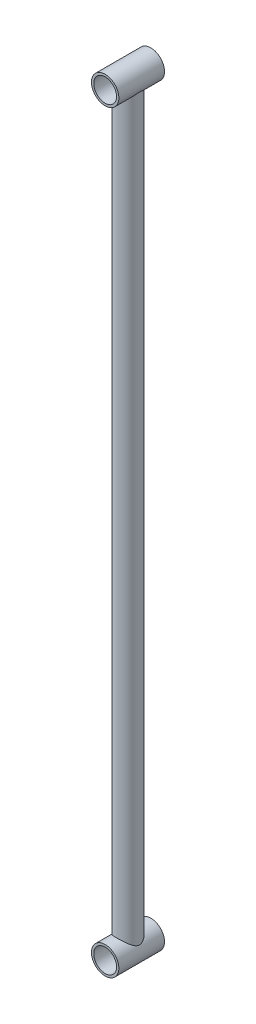
ISO-10303-21;
HEADER;
FILE_DESCRIPTION(('STEP AP214'),'2;1');
FILE_NAME('part.step','',(''),(''),'','','');
FILE_SCHEMA(('AUTOMOTIVE_DESIGN { 1 0 10303 214 1 1 1 1 }'));
ENDSEC;
DATA;
#1=APPLICATION_CONTEXT('core data for automotive mechanical design processes');
#2=APPLICATION_PROTOCOL_DEFINITION('international standard','automotive_design',2000,#1);
#3=PRODUCT_CONTEXT('',#1,'mechanical');
#4=PRODUCT('Part','Part','',(#3));
#5=PRODUCT_RELATED_PRODUCT_CATEGORY('part','',(#4));
#6=PRODUCT_DEFINITION_FORMATION('','',#4);
#7=PRODUCT_DEFINITION_CONTEXT('part definition',#1,'design');
#8=PRODUCT_DEFINITION('design','',#6,#7);
#9=PRODUCT_DEFINITION_SHAPE('','',#8);
#10=(LENGTH_UNIT() NAMED_UNIT(*) SI_UNIT(.MILLI.,.METRE.));
#11=(NAMED_UNIT(*) PLANE_ANGLE_UNIT() SI_UNIT($,.RADIAN.));
#12=(NAMED_UNIT(*) SI_UNIT($,.STERADIAN.) SOLID_ANGLE_UNIT());
#13=UNCERTAINTY_MEASURE_WITH_UNIT(LENGTH_MEASURE(1.E-05),#10,'distance_accuracy_value','');
#14=(GEOMETRIC_REPRESENTATION_CONTEXT(3) GLOBAL_UNCERTAINTY_ASSIGNED_CONTEXT((#13)) GLOBAL_UNIT_ASSIGNED_CONTEXT((#10,
#11,#12)) REPRESENTATION_CONTEXT('',''));
#15=CARTESIAN_POINT('',(0.,0.,0.));
#16=DIRECTION('',(0.,0.,1.));
#17=DIRECTION('',(1.,0.,0.));
#18=AXIS2_PLACEMENT_3D('',#15,#16,#17);
#19=CARTESIAN_POINT('',(0.,104.775,0.));
#20=DIRECTION('',(0.,-1.,0.));
#21=DIRECTION('',(0.,0.,-1.));
#22=AXIS2_PLACEMENT_3D('',#19,#20,#21);
#23=CYLINDRICAL_SURFACE('',#22,3.175);
#24=CARTESIAN_POINT('',(0.,-100.965,-3.175));
#25=CARTESIAN_POINT('',(-0.150822211930841,-100.965006073135,-3.17499378688627));
#26=CARTESIAN_POINT('',(-0.301690443543293,-100.97403411179,-3.16417620713812));
#27=CARTESIAN_POINT('',(-0.598401448690301,-101.00931308306,-3.12170755440397));
#28=CARTESIAN_POINT('',(-0.744240416126178,-101.0355767709,-3.09004105213718));
#29=CARTESIAN_POINT('',(-1.02594514279661,-101.102888730367,-3.00823277189605));
#30=CARTESIAN_POINT('',(-1.16186480706273,-101.143848602994,-2.95820141968177));
#31=CARTESIAN_POINT('',(-1.42219442693835,-101.237676112164,-2.84224148606259));
#32=CARTESIAN_POINT('',(-1.54660047408831,-101.290547771567,-2.77630753348651));
#33=CARTESIAN_POINT('',(-1.82615409494026,-101.426354867903,-2.60417772613267));
#34=CARTESIAN_POINT('',(-1.97580861746992,-101.513199724603,-2.49208889633074));
#35=CARTESIAN_POINT('',(-2.18170392969783,-101.650397122028,-2.30852867378388));
#36=CARTESIAN_POINT('',(-2.24734328885135,-101.697379079135,-2.24463663411199));
#37=CARTESIAN_POINT('',(-2.37241559323832,-101.7927341327,-2.11200517803447));
#38=CARTESIAN_POINT('',(-2.43185081191422,-101.841106711234,-2.0432675528215));
#39=CARTESIAN_POINT('',(-2.54554306145352,-101.939148731739,-1.89983443364988));
#40=CARTESIAN_POINT('',(-2.59968379340744,-101.988825599408,-1.82505217022288));
#41=CARTESIAN_POINT('',(-2.70148698448596,-102.087419895249,-1.67067213031026));
#42=CARTESIAN_POINT('',(-2.74914727429901,-102.136337064283,-1.59107275413046));
#43=CARTESIAN_POINT('',(-2.83770152724148,-102.231817655537,-1.42714203479656));
#44=CARTESIAN_POINT('',(-2.87861142892789,-102.278386436525,-1.34282248643763));
#45=CARTESIAN_POINT('',(-2.95343206651851,-102.367363499049,-1.16910280679462));
#46=CARTESIAN_POINT('',(-2.98734876608987,-102.409775309237,-1.07970708805111));
#47=CARTESIAN_POINT('',(-3.05045756735011,-102.491642592922,-0.886882922117579));
#48=CARTESIAN_POINT('',(-3.0789093422056,-102.530448838894,-0.782924439120834));
#49=CARTESIAN_POINT('',(-3.12548669863083,-102.595766618533,-0.569099957739516));
#50=CARTESIAN_POINT('',(-3.14363734371447,-102.622307964219,-0.45924901591517));
#51=CARTESIAN_POINT('',(-3.1684096231137,-102.65891419836,-0.233977950708097));
#52=CARTESIAN_POINT('',(-3.17488831380236,-102.668774712711,-0.118506333038371));
#53=CARTESIAN_POINT('',(-3.1751088214567,-102.669107484783,0.112474559572194));
#54=CARTESIAN_POINT('',(-3.16885047147159,-102.65957948837,0.227983834986789));
#55=CARTESIAN_POINT('',(-3.14331687074316,-102.621821169251,0.464216225799318));
#56=CARTESIAN_POINT('',(-3.12300099714952,-102.592099426649,0.584572451296942));
#57=CARTESIAN_POINT('',(-3.07013022301828,-102.518359442343,0.818148553911832));
#58=CARTESIAN_POINT('',(-3.03753470891272,-102.474293826329,0.931343278003963));
#59=CARTESIAN_POINT('',(-2.96946713526924,-102.387371620458,1.12753857958931));
#60=CARTESIAN_POINT('',(-2.93595611073522,-102.346120612189,1.21197043377846));
#61=CARTESIAN_POINT('',(-2.86263450076783,-102.260121006486,1.37624264229306));
#62=CARTESIAN_POINT('',(-2.82282022117913,-102.21537036585,1.45608026642605));
#63=CARTESIAN_POINT('',(-2.737123541728,-102.123926671074,1.61141469924887));
#64=CARTESIAN_POINT('',(-2.69123299958051,-102.077231069241,1.68690548483916));
#65=CARTESIAN_POINT('',(-2.59356538330475,-101.983205555332,1.83352148541103));
#66=CARTESIAN_POINT('',(-2.54178949143858,-101.93587577233,1.90464757277783));
#67=CARTESIAN_POINT('',(-2.42951698129755,-101.839132829216,2.04612861759571));
#68=CARTESIAN_POINT('',(-2.36870621957647,-101.789739885102,2.11624950855538));
#69=CARTESIAN_POINT('',(-2.24061704208414,-101.692431913034,2.251431693159));
#70=CARTESIAN_POINT('',(-2.17333605668939,-101.644517482328,2.3164909578878));
#71=CARTESIAN_POINT('',(-1.96202962966033,-101.504691065171,2.50325715541089));
#72=CARTESIAN_POINT('',(-1.8081760202615,-101.416368515353,2.61701675075466));
#73=CARTESIAN_POINT('',(-1.51651718744448,-101.277043768211,2.79326540719812));
#74=CARTESIAN_POINT('',(-1.38398135723523,-101.22219627429,2.86148984440411));
#75=CARTESIAN_POINT('',(-1.10623310991177,-101.126190568919,2.97985692174476));
#76=CARTESIAN_POINT('',(-0.961028675731065,-101.085023814294,3.03001084797634));
#77=CARTESIAN_POINT('',(-0.735782533163238,-101.035917182569,3.08956068904863));
#78=CARTESIAN_POINT('',(-0.659105251542801,-101.021620844953,3.1068381749323));
#79=CARTESIAN_POINT('',(-0.5039929094941,-100.997668519091,3.1357336252596));
#80=CARTESIAN_POINT('',(-0.425558729080255,-100.988010259768,3.14735435962114));
#81=CARTESIAN_POINT('',(-0.267613766694443,-100.973583326387,3.16469854719628));
#82=CARTESIAN_POINT('',(-0.188103294378078,-100.968813275034,3.17042366155495));
#83=CARTESIAN_POINT('',(-0.0287609172063097,-100.964273313947,3.17587210143098));
#84=CARTESIAN_POINT('',(0.0510709517295108,-100.964502860158,3.17559607999075));
#85=CARTESIAN_POINT('',(0.270806444569592,-100.972062740094,3.16652460681941));
#86=CARTESIAN_POINT('',(0.410349895405356,-100.984646465584,3.15142655934367));
#87=CARTESIAN_POINT('',(0.684104999351103,-101.024360993693,3.10354494319568));
#88=CARTESIAN_POINT('',(0.818316010811665,-101.051493541303,3.07075925305744));
#89=CARTESIAN_POINT('',(1.08021205051514,-101.118804951484,2.98878648153561));
#90=CARTESIAN_POINT('',(1.20778546163934,-101.159153847951,2.93938540115662));
#91=CARTESIAN_POINT('',(1.45244504548873,-101.250287792534,2.82652074436458));
#92=CARTESIAN_POINT('',(1.56952731907496,-101.301076697875,2.76305196974067));
#93=CARTESIAN_POINT('',(1.84237637325781,-101.435232697248,2.59277570023338));
#94=CARTESIAN_POINT('',(1.99188980965388,-101.522984618519,2.4793083516323));
#95=CARTESIAN_POINT('',(2.19739618958484,-101.66140876003,2.29361331504068));
#96=CARTESIAN_POINT('',(2.26288530573975,-101.708786476106,2.22898487800641));
#97=CARTESIAN_POINT('',(2.3875915478425,-101.804868185053,2.09485196479308));
#98=CARTESIAN_POINT('',(2.44681106677348,-101.85357166292,2.02534936594778));
#99=CARTESIAN_POINT('',(2.55997146983506,-101.95216767485,1.88036843728749));
#100=CARTESIAN_POINT('',(2.61379799811067,-102.002065820305,1.80480499133832));
#101=CARTESIAN_POINT('',(2.7149027848302,-102.100976499726,1.64880876354097));
#102=CARTESIAN_POINT('',(2.76217868695505,-102.149988709528,1.56837424439768));
#103=CARTESIAN_POINT('',(2.84986479530632,-102.245463007663,1.402731275326));
#104=CARTESIAN_POINT('',(2.89029310458778,-102.291931593013,1.31753623073996));
#105=CARTESIAN_POINT('',(2.96403866535854,-102.380446080838,1.14199615177066));
#106=CARTESIAN_POINT('',(2.99736243306947,-102.422496017945,1.05165593372184));
#107=CARTESIAN_POINT('',(3.05863438069324,-102.502645387512,0.85817675717233));
#108=CARTESIAN_POINT('',(3.08595157784812,-102.540171951302,0.754590283142033));
#109=CARTESIAN_POINT('',(3.13032466121903,-102.602753097614,0.541715982577732));
#110=CARTESIAN_POINT('',(3.14740617392447,-102.627838800195,0.43244314528516));
#111=CARTESIAN_POINT('',(3.17013957612192,-102.661525484273,0.208740257934578));
#112=CARTESIAN_POINT('',(3.17565785999514,-102.669933709663,0.0942653723089426));
#113=CARTESIAN_POINT('',(3.17421509286501,-102.667761282413,-0.134433621338763));
#114=CARTESIAN_POINT('',(3.16725075125176,-102.657175622696,-0.248657655284779));
#115=CARTESIAN_POINT('',(3.14026889782403,-102.617360180191,-0.484724010216901));
#116=CARTESIAN_POINT('',(3.11894000449995,-102.586264565751,-0.606081817587711));
#117=CARTESIAN_POINT('',(3.06387912815266,-102.509844176245,-0.841415374096074));
#118=CARTESIAN_POINT('',(3.03010612437192,-102.464472414373,-0.95536522532451));
#119=CARTESIAN_POINT('',(2.95974616986959,-102.375301667574,-1.1528902082544));
#120=CARTESIAN_POINT('',(2.92514020824604,-102.333071504198,-1.23791824005944));
#121=CARTESIAN_POINT('',(2.84950508751847,-102.245221372332,-1.40328824862223));
#122=CARTESIAN_POINT('',(2.80847219392224,-102.199599441137,-1.48362746336257));
#123=CARTESIAN_POINT('',(2.72020405219331,-102.106533762075,-1.6398704117791));
#124=CARTESIAN_POINT('',(2.67296054253818,-102.059087648184,-1.71576803929565));
#125=CARTESIAN_POINT('',(2.57244498764799,-101.963695979689,-1.8630894354351));
#126=CARTESIAN_POINT('',(2.51917415808048,-101.915750527563,-1.93451410172382));
#127=CARTESIAN_POINT('',(2.40385916661768,-101.818051793767,-2.0762540808046));
#128=CARTESIAN_POINT('',(2.34151296317675,-101.768325087423,-2.14634342701283));
#129=CARTESIAN_POINT('',(2.21022611937576,-101.670531701715,-2.28131637653497));
#130=CARTESIAN_POINT('',(2.14128276360214,-101.622465717085,-2.34619781587424));
#131=CARTESIAN_POINT('',(1.92481569991962,-101.482500145393,-2.53214893370211));
#132=CARTESIAN_POINT('',(1.76727022711828,-101.394493094446,-2.64500363295819));
#133=CARTESIAN_POINT('',(1.47135047042502,-101.257822867897,-2.81726894962884));
#134=CARTESIAN_POINT('',(1.33857456032353,-101.204872770339,-2.88295154675527));
#135=CARTESIAN_POINT('',(1.0610124126945,-101.112812065803,-2.99620507595873));
#136=CARTESIAN_POINT('',(0.91624249032127,-101.073683027923,-3.0438001349298));
#137=CARTESIAN_POINT('',(0.643406655873653,-101.017593399518,-3.11173987048758));
#138=CARTESIAN_POINT('',(0.516693515753986,-100.997992662401,-3.13534453629448));
#139=CARTESIAN_POINT('',(0.259998091130878,-100.971694009641,-3.16697647660939));
#140=CARTESIAN_POINT('',(0.130016144835493,-100.96499476466,-3.1750053560088));
#141=CARTESIAN_POINT('',(0.,-100.965,-3.175));
#142=B_SPLINE_CURVE_WITH_KNOTS('',3,(#24,#25,#26,#27,#28,#29,#30,#31,#32,#33,#34,#35,#36,#37,
#38,#39,#40,#41,#42,#43,#44,#45,#46,#47,#48,#49,#50,#51,#52,#53,#54,#55,#56,#57,#58,#59,#60,#61,
#62,#63,#64,#65,#66,#67,#68,#69,#70,#71,#72,#73,#74,#75,#76,#77,#78,#79,#80,#81,#82,#83,#84,#85,
#86,#87,#88,#89,#90,#91,#92,#93,#94,#95,#96,#97,#98,#99,#100,#101,#102,#103,#104,#105,#106,#107,
#108,#109,#110,#111,#112,#113,#114,#115,#116,#117,#118,#119,#120,#121,#122,#123,#124,#125,#126,
#127,#128,#129,#130,#131,#132,#133,#134,#135,#136,#137,#138,#139,#140,#141),.UNSPECIFIED.,.T.,
.F.,(4,2,2,2,2,2,2,2,2,2,2,2,2,2,2,2,2,2,2,2,2,2,2,2,2,2,2,2,2,2,2,2,2,2,2,2,2,2,2,2,2,2,2,2,2,
2,2,2,2,2,2,2,2,2,2,2,2,2,4),(0.,0.451918421555196,0.90417166260424,1.35374894806629,
1.80347829334246,2.41839977025361,2.72701799603031,3.03552273192493,3.34974152574338,
3.66406524590609,3.97763584416515,4.29093791931023,4.63359226787793,4.97540929555955,
5.32138473147249,5.66736470228832,6.04215732186178,6.41820056754933,6.71711983599405,
7.01621494535695,7.31571498144281,7.6151549592699,7.93022593415776,8.24542255908012,
8.87381282386929,9.34860609577829,9.82310231522312,10.0624740368443,10.3017284281116,
10.5409153887976,10.7800763213364,11.2006233771617,11.6212208848594,12.0474573079466,
12.4738514947403,13.0918171368879,13.4020682167871,13.7122004497068,14.0279214775753,
14.3437557799352,14.6587416141479,14.9734372913319,15.3129447407211,15.6515985944804,
15.9941442726696,16.3367802643905,16.7159132139336,17.0963072841967,17.3990678074814,
17.7020049127365,18.0053491494056,18.3086323123993,18.6267807496175,18.9450607059121,
19.5795398645421,20.0497356350819,20.5193019933689,20.9089179875348,21.2984938344776),.UNSPECIFIED.);
#143=CARTESIAN_POINT('',(0.,-100.965,-3.175));
#144=VERTEX_POINT('',#143);
#145=EDGE_CURVE('E39',#144,#144,#142,.T.);
#146=ORIENTED_EDGE('',*,*,#145,.T.);
#147=EDGE_LOOP('',(#146));
#148=FACE_BOUND('',#147,.T.);
#149=CARTESIAN_POINT('',(0.,100.965,-3.175));
#150=CARTESIAN_POINT('',(-0.150822211930841,100.965006073135,-3.17499378688627));
#151=CARTESIAN_POINT('',(-0.301690443543293,100.97403411179,-3.16417620713812));
#152=CARTESIAN_POINT('',(-0.598401448690301,101.00931308306,-3.12170755440397));
#153=CARTESIAN_POINT('',(-0.744240416126178,101.0355767709,-3.09004105213718));
#154=CARTESIAN_POINT('',(-1.02594514279661,101.102888730367,-3.00823277189605));
#155=CARTESIAN_POINT('',(-1.16186480706273,101.143848602994,-2.95820141968177));
#156=CARTESIAN_POINT('',(-1.42219442693835,101.237676112164,-2.84224148606259));
#157=CARTESIAN_POINT('',(-1.54660047408831,101.290547771567,-2.77630753348651));
#158=CARTESIAN_POINT('',(-1.82615409494026,101.426354867903,-2.60417772613267));
#159=CARTESIAN_POINT('',(-1.97580861746992,101.513199724603,-2.49208889633074));
#160=CARTESIAN_POINT('',(-2.18170392969783,101.650397122028,-2.30852867378388));
#161=CARTESIAN_POINT('',(-2.24734328885135,101.697379079135,-2.24463663411199));
#162=CARTESIAN_POINT('',(-2.37241559323832,101.7927341327,-2.11200517803447));
#163=CARTESIAN_POINT('',(-2.43185081191422,101.841106711234,-2.0432675528215));
#164=CARTESIAN_POINT('',(-2.54554306145352,101.939148731739,-1.89983443364988));
#165=CARTESIAN_POINT('',(-2.59968379340744,101.988825599408,-1.82505217022288));
#166=CARTESIAN_POINT('',(-2.70148698448596,102.087419895249,-1.67067213031026));
#167=CARTESIAN_POINT('',(-2.74914727429901,102.136337064283,-1.59107275413046));
#168=CARTESIAN_POINT('',(-2.83770152724148,102.231817655537,-1.42714203479656));
#169=CARTESIAN_POINT('',(-2.87861142892789,102.278386436525,-1.34282248643763));
#170=CARTESIAN_POINT('',(-2.95343206651851,102.367363499049,-1.16910280679462));
#171=CARTESIAN_POINT('',(-2.98734876608987,102.409775309237,-1.07970708805111));
#172=CARTESIAN_POINT('',(-3.05045756735011,102.491642592922,-0.886882922117579));
#173=CARTESIAN_POINT('',(-3.0789093422056,102.530448838894,-0.782924439120834));
#174=CARTESIAN_POINT('',(-3.12548669863083,102.595766618533,-0.569099957739516));
#175=CARTESIAN_POINT('',(-3.14363734371447,102.622307964219,-0.45924901591517));
#176=CARTESIAN_POINT('',(-3.1684096231137,102.65891419836,-0.233977950708097));
#177=CARTESIAN_POINT('',(-3.17488831380236,102.668774712711,-0.118506333038371));
#178=CARTESIAN_POINT('',(-3.1751088214567,102.669107484783,0.112474559572194));
#179=CARTESIAN_POINT('',(-3.16885047147159,102.65957948837,0.227983834986789));
#180=CARTESIAN_POINT('',(-3.14331687074316,102.621821169251,0.464216225799318));
#181=CARTESIAN_POINT('',(-3.12300099714952,102.592099426649,0.584572451296942));
#182=CARTESIAN_POINT('',(-3.07013022301828,102.518359442343,0.818148553911832));
#183=CARTESIAN_POINT('',(-3.03753470891272,102.474293826329,0.931343278003963));
#184=CARTESIAN_POINT('',(-2.96946713526924,102.387371620458,1.12753857958931));
#185=CARTESIAN_POINT('',(-2.93595611073522,102.346120612189,1.21197043377846));
#186=CARTESIAN_POINT('',(-2.86263450076783,102.260121006486,1.37624264229306));
#187=CARTESIAN_POINT('',(-2.82282022117913,102.21537036585,1.45608026642605));
#188=CARTESIAN_POINT('',(-2.737123541728,102.123926671074,1.61141469924887));
#189=CARTESIAN_POINT('',(-2.69123299958051,102.077231069241,1.68690548483916));
#190=CARTESIAN_POINT('',(-2.59356538330475,101.983205555332,1.83352148541103));
#191=CARTESIAN_POINT('',(-2.54178949143858,101.93587577233,1.90464757277783));
#192=CARTESIAN_POINT('',(-2.42951698129755,101.839132829216,2.04612861759571));
#193=CARTESIAN_POINT('',(-2.36870621957647,101.789739885102,2.11624950855538));
#194=CARTESIAN_POINT('',(-2.24061704208414,101.692431913034,2.251431693159));
#195=CARTESIAN_POINT('',(-2.17333605668939,101.644517482328,2.3164909578878));
#196=CARTESIAN_POINT('',(-1.96202962966033,101.504691065171,2.50325715541089));
#197=CARTESIAN_POINT('',(-1.8081760202615,101.416368515353,2.61701675075466));
#198=CARTESIAN_POINT('',(-1.51651718744448,101.277043768211,2.79326540719812));
#199=CARTESIAN_POINT('',(-1.38398135723523,101.22219627429,2.86148984440411));
#200=CARTESIAN_POINT('',(-1.10623310991177,101.126190568919,2.97985692174476));
#201=CARTESIAN_POINT('',(-0.961028675731065,101.085023814294,3.03001084797634));
#202=CARTESIAN_POINT('',(-0.735782533163238,101.035917182569,3.08956068904863));
#203=CARTESIAN_POINT('',(-0.659105251542801,101.021620844953,3.1068381749323));
#204=CARTESIAN_POINT('',(-0.5039929094941,100.997668519091,3.1357336252596));
#205=CARTESIAN_POINT('',(-0.425558729080255,100.988010259768,3.14735435962114));
#206=CARTESIAN_POINT('',(-0.267613766694443,100.973583326387,3.16469854719628));
#207=CARTESIAN_POINT('',(-0.188103294378078,100.968813275034,3.17042366155495));
#208=CARTESIAN_POINT('',(-0.0287609172063097,100.964273313947,3.17587210143098));
#209=CARTESIAN_POINT('',(0.0510709517295108,100.964502860158,3.17559607999075));
#210=CARTESIAN_POINT('',(0.270806444569592,100.972062740094,3.16652460681941));
#211=CARTESIAN_POINT('',(0.410349895405356,100.984646465584,3.15142655934367));
#212=CARTESIAN_POINT('',(0.684104999351103,101.024360993693,3.10354494319568));
#213=CARTESIAN_POINT('',(0.818316010811665,101.051493541303,3.07075925305744));
#214=CARTESIAN_POINT('',(1.08021205051514,101.118804951484,2.98878648153561));
#215=CARTESIAN_POINT('',(1.20778546163934,101.159153847951,2.93938540115662));
#216=CARTESIAN_POINT('',(1.45244504548873,101.250287792534,2.82652074436458));
#217=CARTESIAN_POINT('',(1.56952731907496,101.301076697875,2.76305196974067));
#218=CARTESIAN_POINT('',(1.84237637325781,101.435232697248,2.59277570023338));
#219=CARTESIAN_POINT('',(1.99188980965388,101.522984618519,2.4793083516323));
#220=CARTESIAN_POINT('',(2.19739618958484,101.66140876003,2.29361331504068));
#221=CARTESIAN_POINT('',(2.26288530573975,101.708786476106,2.22898487800641));
#222=CARTESIAN_POINT('',(2.3875915478425,101.804868185053,2.09485196479308));
#223=CARTESIAN_POINT('',(2.44681106677348,101.85357166292,2.02534936594778));
#224=CARTESIAN_POINT('',(2.55997146983506,101.95216767485,1.88036843728749));
#225=CARTESIAN_POINT('',(2.61379799811067,102.002065820305,1.80480499133832));
#226=CARTESIAN_POINT('',(2.7149027848302,102.100976499726,1.64880876354097));
#227=CARTESIAN_POINT('',(2.76217868695505,102.149988709528,1.56837424439768));
#228=CARTESIAN_POINT('',(2.84986479530632,102.245463007663,1.402731275326));
#229=CARTESIAN_POINT('',(2.89029310458778,102.291931593013,1.31753623073996));
#230=CARTESIAN_POINT('',(2.96403866535854,102.380446080838,1.14199615177066));
#231=CARTESIAN_POINT('',(2.99736243306947,102.422496017945,1.05165593372184));
#232=CARTESIAN_POINT('',(3.05863438069324,102.502645387512,0.85817675717233));
#233=CARTESIAN_POINT('',(3.08595157784812,102.540171951302,0.754590283142033));
#234=CARTESIAN_POINT('',(3.13032466121903,102.602753097614,0.541715982577732));
#235=CARTESIAN_POINT('',(3.14740617392447,102.627838800195,0.43244314528516));
#236=CARTESIAN_POINT('',(3.17013957612192,102.661525484273,0.208740257934578));
#237=CARTESIAN_POINT('',(3.17565785999514,102.669933709663,0.0942653723089426));
#238=CARTESIAN_POINT('',(3.17421509286501,102.667761282413,-0.134433621338763));
#239=CARTESIAN_POINT('',(3.16725075125176,102.657175622696,-0.248657655284779));
#240=CARTESIAN_POINT('',(3.14026889782403,102.617360180191,-0.484724010216901));
#241=CARTESIAN_POINT('',(3.11894000449995,102.586264565751,-0.606081817587711));
#242=CARTESIAN_POINT('',(3.06387912815266,102.509844176245,-0.841415374096074));
#243=CARTESIAN_POINT('',(3.03010612437192,102.464472414373,-0.95536522532451));
#244=CARTESIAN_POINT('',(2.95974616986959,102.375301667574,-1.1528902082544));
#245=CARTESIAN_POINT('',(2.92514020824604,102.333071504198,-1.23791824005944));
#246=CARTESIAN_POINT('',(2.84950508751847,102.245221372332,-1.40328824862223));
#247=CARTESIAN_POINT('',(2.80847219392224,102.199599441137,-1.48362746336257));
#248=CARTESIAN_POINT('',(2.72020405219331,102.106533762075,-1.6398704117791));
#249=CARTESIAN_POINT('',(2.67296054253818,102.059087648184,-1.71576803929565));
#250=CARTESIAN_POINT('',(2.57244498764799,101.963695979689,-1.8630894354351));
#251=CARTESIAN_POINT('',(2.51917415808048,101.915750527563,-1.93451410172382));
#252=CARTESIAN_POINT('',(2.40385916661768,101.818051793767,-2.0762540808046));
#253=CARTESIAN_POINT('',(2.34151296317675,101.768325087423,-2.14634342701283));
#254=CARTESIAN_POINT('',(2.21022611937576,101.670531701715,-2.28131637653497));
#255=CARTESIAN_POINT('',(2.14128276360214,101.622465717085,-2.34619781587424));
#256=CARTESIAN_POINT('',(1.92481569991962,101.482500145393,-2.53214893370211));
#257=CARTESIAN_POINT('',(1.76727022711828,101.394493094446,-2.64500363295819));
#258=CARTESIAN_POINT('',(1.47135047042502,101.257822867897,-2.81726894962884));
#259=CARTESIAN_POINT('',(1.33857456032353,101.204872770339,-2.88295154675527));
#260=CARTESIAN_POINT('',(1.0610124126945,101.112812065803,-2.99620507595873));
#261=CARTESIAN_POINT('',(0.91624249032127,101.073683027923,-3.0438001349298));
#262=CARTESIAN_POINT('',(0.643406655873653,101.017593399518,-3.11173987048758));
#263=CARTESIAN_POINT('',(0.516693515753986,100.997992662401,-3.13534453629448));
#264=CARTESIAN_POINT('',(0.259998091130878,100.971694009641,-3.16697647660939));
#265=CARTESIAN_POINT('',(0.130016144835493,100.96499476466,-3.1750053560088));
#266=CARTESIAN_POINT('',(0.,100.965,-3.175));
#267=B_SPLINE_CURVE_WITH_KNOTS('',3,(#149,#150,#151,#152,#153,#154,#155,#156,#157,#158,#159,
#160,#161,#162,#163,#164,#165,#166,#167,#168,#169,#170,#171,#172,#173,#174,#175,#176,#177,#178,
#179,#180,#181,#182,#183,#184,#185,#186,#187,#188,#189,#190,#191,#192,#193,#194,#195,#196,#197,
#198,#199,#200,#201,#202,#203,#204,#205,#206,#207,#208,#209,#210,#211,#212,#213,#214,#215,#216,
#217,#218,#219,#220,#221,#222,#223,#224,#225,#226,#227,#228,#229,#230,#231,#232,#233,#234,#235,
#236,#237,#238,#239,#240,#241,#242,#243,#244,#245,#246,#247,#248,#249,#250,#251,#252,#253,#254,
#255,#256,#257,#258,#259,#260,#261,#262,#263,#264,#265,#266),.UNSPECIFIED.,.T.,.F.,(4,2,2,2,2,2,
2,2,2,2,2,2,2,2,2,2,2,2,2,2,2,2,2,2,2,2,2,2,2,2,2,2,2,2,2,2,2,2,2,2,2,2,2,2,2,2,2,2,2,2,2,2,2,2,
2,2,2,2,4),(0.,0.451918421555196,0.90417166260424,1.35374894806629,1.80347829334246,
2.41839977025361,2.72701799603031,3.03552273192493,3.34974152574338,3.66406524590609,
3.97763584416515,4.29093791931023,4.63359226787793,4.97540929555955,5.32138473147249,
5.66736470228832,6.04215732186178,6.41820056754933,6.71711983599405,7.01621494535695,
7.31571498144281,7.6151549592699,7.93022593415776,8.24542255908012,8.87381282386929,
9.34860609577829,9.82310231522312,10.0624740368443,10.3017284281116,10.5409153887976,
10.7800763213364,11.2006233771617,11.6212208848594,12.0474573079466,12.4738514947403,
13.0918171368879,13.4020682167871,13.7122004497068,14.0279214775753,14.3437557799352,
14.6587416141479,14.9734372913319,15.3129447407211,15.6515985944804,15.9941442726696,
16.3367802643905,16.7159132139336,17.0963072841967,17.3990678074814,17.7020049127365,
18.0053491494056,18.3086323123993,18.6267807496175,18.9450607059121,19.5795398645421,
20.0497356350819,20.5193019933689,20.9089179875348,21.2984938344776),.UNSPECIFIED.);
#268=CARTESIAN_POINT('',(0.,100.965,-3.175));
#269=VERTEX_POINT('',#268);
#270=EDGE_CURVE('E10',#269,#269,#267,.T.);
#271=ORIENTED_EDGE('',*,*,#270,.F.);
#272=EDGE_LOOP('',(#271));
#273=FACE_BOUND('',#272,.T.);
#274=ADVANCED_FACE('F35',(#148,#273),#23,.T.);
#275=CARTESIAN_POINT('',(0.,104.775,6.35));
#276=DIRECTION('',(0.,0.,-1.));
#277=DIRECTION('',(-1.,0.,0.));
#278=AXIS2_PLACEMENT_3D('',#275,#276,#277);
#279=CYLINDRICAL_SURFACE('',#278,3.81);
#280=CARTESIAN_POINT('',(0.,104.775,-6.35));
#281=DIRECTION('',(0.,0.,1.));
#282=DIRECTION('',(1.,0.,0.));
#283=AXIS2_PLACEMENT_3D('',#280,#281,#282);
#284=CIRCLE('',#283,3.81);
#285=CARTESIAN_POINT('',(3.81,104.775,-6.35));
#286=VERTEX_POINT('',#285);
#287=EDGE_CURVE('E53',#286,#286,#284,.T.);
#288=ORIENTED_EDGE('',*,*,#287,.T.);
#289=EDGE_LOOP('',(#288));
#290=FACE_BOUND('',#289,.T.);
#291=CARTESIAN_POINT('',(0.,104.775,6.35));
#292=DIRECTION('',(0.,0.,1.));
#293=DIRECTION('',(1.,0.,0.));
#294=AXIS2_PLACEMENT_3D('',#291,#292,#293);
#295=CIRCLE('',#294,3.81);
#296=CARTESIAN_POINT('',(3.81,104.775,6.35));
#297=VERTEX_POINT('',#296);
#298=EDGE_CURVE('E48',#297,#297,#295,.T.);
#299=ORIENTED_EDGE('',*,*,#298,.F.);
#300=EDGE_LOOP('',(#299));
#301=FACE_BOUND('',#300,.T.);
#302=ORIENTED_EDGE('',*,*,#270,.T.);
#303=EDGE_LOOP('',(#302));
#304=FACE_BOUND('',#303,.T.);
#305=ADVANCED_FACE('F59',(#290,#301,#304),#279,.T.);
#306=CARTESIAN_POINT('',(0.,104.775,6.35));
#307=DIRECTION('',(0.,0.,1.));
#308=DIRECTION('',(1.,0.,0.));
#309=AXIS2_PLACEMENT_3D('',#306,#307,#308);
#310=PLANE('',#309);
#311=CARTESIAN_POINT('',(0.,104.775,6.35));
#312=DIRECTION('',(0.,0.,1.));
#313=DIRECTION('',(1.,0.,0.));
#314=AXIS2_PLACEMENT_3D('',#311,#312,#313);
#315=CIRCLE('',#314,3.175);
#316=CARTESIAN_POINT('',(3.175,104.775,6.35));
#317=VERTEX_POINT('',#316);
#318=EDGE_CURVE('E104',#317,#317,#315,.T.);
#319=ORIENTED_EDGE('',*,*,#318,.F.);
#320=EDGE_LOOP('',(#319));
#321=FACE_BOUND('',#320,.T.);
#322=ORIENTED_EDGE('',*,*,#298,.T.);
#323=EDGE_LOOP('',(#322));
#324=FACE_BOUND('',#323,.T.);
#325=ADVANCED_FACE('F63',(#321,#324),#310,.T.);
#326=CARTESIAN_POINT('',(0.,104.775,-6.35));
#327=DIRECTION('',(0.,0.,1.));
#328=DIRECTION('',(1.,0.,0.));
#329=AXIS2_PLACEMENT_3D('',#326,#327,#328);
#330=PLANE('',#329);
#331=CARTESIAN_POINT('',(0.,104.775,-6.35));
#332=DIRECTION('',(0.,0.,1.));
#333=DIRECTION('',(1.,0.,0.));
#334=AXIS2_PLACEMENT_3D('',#331,#332,#333);
#335=CIRCLE('',#334,3.175);
#336=CARTESIAN_POINT('',(3.175,104.775,-6.35));
#337=VERTEX_POINT('',#336);
#338=EDGE_CURVE('E109',#337,#337,#335,.F.);
#339=ORIENTED_EDGE('',*,*,#338,.F.);
#340=EDGE_LOOP('',(#339));
#341=FACE_BOUND('',#340,.T.);
#342=ORIENTED_EDGE('',*,*,#287,.F.);
#343=EDGE_LOOP('',(#342));
#344=FACE_BOUND('',#343,.T.);
#345=ADVANCED_FACE('F65',(#341,#344),#330,.F.);
#346=CARTESIAN_POINT('',(0.,104.775,-15.3302561210691));
#347=DIRECTION('',(0.,0.,1.));
#348=DIRECTION('',(1.,0.,0.));
#349=AXIS2_PLACEMENT_3D('',#346,#347,#348);
#350=CYLINDRICAL_SURFACE('',#349,3.175);
#351=ORIENTED_EDGE('',*,*,#338,.T.);
#352=EDGE_LOOP('',(#351));
#353=FACE_BOUND('',#352,.T.);
#354=ORIENTED_EDGE('',*,*,#318,.T.);
#355=EDGE_LOOP('',(#354));
#356=FACE_BOUND('',#355,.T.);
#357=ADVANCED_FACE('F68',(#353,#356),#350,.F.);
#358=CARTESIAN_POINT('',(0.,-104.775,6.35));
#359=DIRECTION('',(0.,0.,-1.));
#360=DIRECTION('',(-1.,0.,0.));
#361=AXIS2_PLACEMENT_3D('',#358,#359,#360);
#362=CYLINDRICAL_SURFACE('',#361,3.81);
#363=CARTESIAN_POINT('',(0.,-104.775,6.35));
#364=DIRECTION('',(0.,0.,-1.));
#365=DIRECTION('',(1.,0.,0.));
#366=AXIS2_PLACEMENT_3D('',#363,#364,#365);
#367=CIRCLE('',#366,3.81);
#368=CARTESIAN_POINT('',(3.81,-104.775,6.35));
#369=VERTEX_POINT('',#368);
#370=EDGE_CURVE('E105',#369,#369,#367,.T.);
#371=ORIENTED_EDGE('',*,*,#370,.T.);
#372=EDGE_LOOP('',(#371));
#373=FACE_BOUND('',#372,.T.);
#374=CARTESIAN_POINT('',(0.,-104.775,-6.35));
#375=DIRECTION('',(0.,0.,-1.));
#376=DIRECTION('',(1.,0.,0.));
#377=AXIS2_PLACEMENT_3D('',#374,#375,#376);
#378=CIRCLE('',#377,3.81);
#379=CARTESIAN_POINT('',(3.81,-104.775,-6.35));
#380=VERTEX_POINT('',#379);
#381=EDGE_CURVE('E112',#380,#380,#378,.T.);
#382=ORIENTED_EDGE('',*,*,#381,.F.);
#383=EDGE_LOOP('',(#382));
#384=FACE_BOUND('',#383,.T.);
#385=ORIENTED_EDGE('',*,*,#145,.F.);
#386=EDGE_LOOP('',(#385));
#387=FACE_BOUND('',#386,.T.);
#388=ADVANCED_FACE('F74',(#373,#384,#387),#362,.T.);
#389=CARTESIAN_POINT('',(0.,-104.775,6.35));
#390=DIRECTION('',(0.,0.,1.));
#391=DIRECTION('',(1.,0.,0.));
#392=AXIS2_PLACEMENT_3D('',#389,#390,#391);
#393=PLANE('',#392);
#394=CARTESIAN_POINT('',(0.,-104.775,6.35));
#395=DIRECTION('',(0.,0.,-1.));
#396=DIRECTION('',(1.,0.,0.));
#397=AXIS2_PLACEMENT_3D('',#394,#395,#396);
#398=CIRCLE('',#397,3.175);
#399=CARTESIAN_POINT('',(3.175,-104.775,6.35));
#400=VERTEX_POINT('',#399);
#401=EDGE_CURVE('E136',#400,#400,#398,.T.);
#402=ORIENTED_EDGE('',*,*,#401,.T.);
#403=EDGE_LOOP('',(#402));
#404=FACE_BOUND('',#403,.T.);
#405=ORIENTED_EDGE('',*,*,#370,.F.);
#406=EDGE_LOOP('',(#405));
#407=FACE_BOUND('',#406,.T.);
#408=ADVANCED_FACE('F79',(#404,#407),#393,.T.);
#409=CARTESIAN_POINT('',(0.,-104.775,-6.35));
#410=DIRECTION('',(0.,0.,1.));
#411=DIRECTION('',(1.,0.,0.));
#412=AXIS2_PLACEMENT_3D('',#409,#410,#411);
#413=PLANE('',#412);
#414=CARTESIAN_POINT('',(0.,-104.775,-6.35));
#415=DIRECTION('',(0.,0.,1.));
#416=DIRECTION('',(1.,0.,0.));
#417=AXIS2_PLACEMENT_3D('',#414,#415,#416);
#418=CIRCLE('',#417,3.175);
#419=CARTESIAN_POINT('',(3.175,-104.775,-6.35));
#420=VERTEX_POINT('',#419);
#421=EDGE_CURVE('E117',#420,#420,#418,.T.);
#422=ORIENTED_EDGE('',*,*,#421,.T.);
#423=EDGE_LOOP('',(#422));
#424=FACE_BOUND('',#423,.T.);
#425=ORIENTED_EDGE('',*,*,#381,.T.);
#426=EDGE_LOOP('',(#425));
#427=FACE_BOUND('',#426,.T.);
#428=ADVANCED_FACE('F81',(#424,#427),#413,.F.);
#429=CARTESIAN_POINT('',(0.,-104.775,-15.3302561210691));
#430=DIRECTION('',(0.,0.,1.));
#431=DIRECTION('',(1.,0.,0.));
#432=AXIS2_PLACEMENT_3D('',#429,#430,#431);
#433=CYLINDRICAL_SURFACE('',#432,3.175);
#434=ORIENTED_EDGE('',*,*,#421,.F.);
#435=EDGE_LOOP('',(#434));
#436=FACE_BOUND('',#435,.T.);
#437=ORIENTED_EDGE('',*,*,#401,.F.);
#438=EDGE_LOOP('',(#437));
#439=FACE_BOUND('',#438,.T.);
#440=ADVANCED_FACE('F84',(#436,#439),#433,.F.);
#441=CLOSED_SHELL('',(#274,#305,#325,#345,#357,#388,#408,#428,#440));
#442=MANIFOLD_SOLID_BREP('B2',#441);
#443=ADVANCED_BREP_SHAPE_REPRESENTATION('',(#18,#442),#14);
#444=SHAPE_DEFINITION_REPRESENTATION(#9,#443);
ENDSEC;
END-ISO-10303-21;
